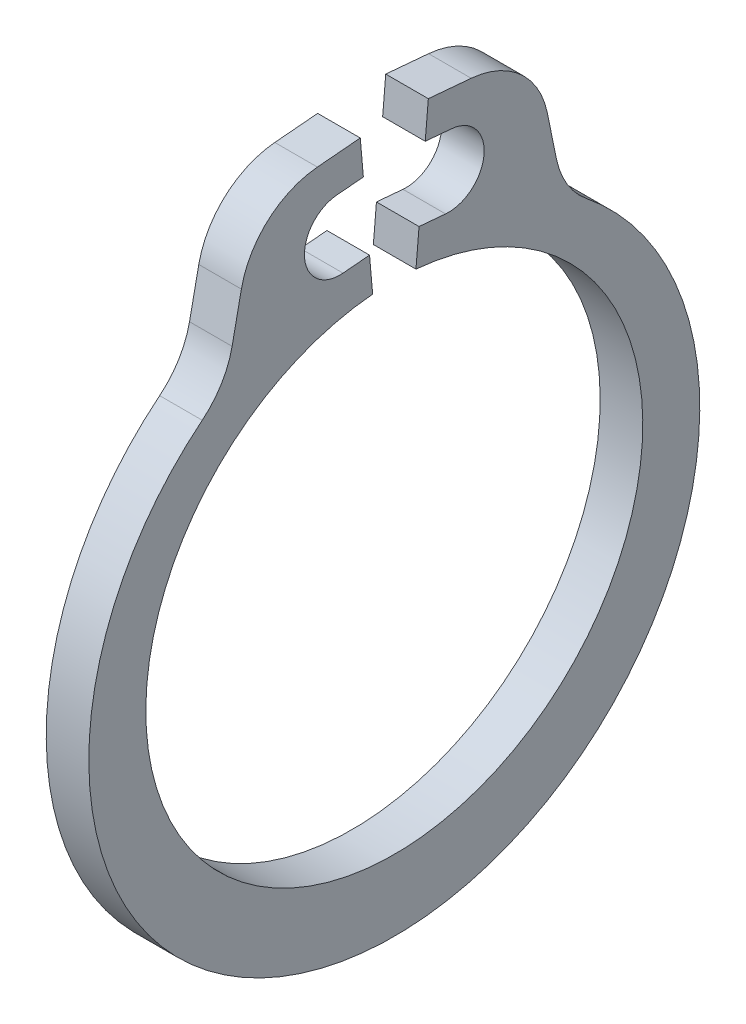
ISO-10303-21;
HEADER;
FILE_DESCRIPTION(('STEP AP214'),'2;1');
FILE_NAME('part.step','',(''),(''),'','','');
FILE_SCHEMA(('AUTOMOTIVE_DESIGN { 1 0 10303 214 1 1 1 1 }'));
ENDSEC;
DATA;
#1=APPLICATION_CONTEXT('core data for automotive mechanical design processes');
#2=APPLICATION_PROTOCOL_DEFINITION('international standard','automotive_design',2000,#1);
#3=PRODUCT_CONTEXT('',#1,'mechanical');
#4=PRODUCT('Part','Part','',(#3));
#5=PRODUCT_RELATED_PRODUCT_CATEGORY('part','',(#4));
#6=PRODUCT_DEFINITION_FORMATION('','',#4);
#7=PRODUCT_DEFINITION_CONTEXT('part definition',#1,'design');
#8=PRODUCT_DEFINITION('design','',#6,#7);
#9=PRODUCT_DEFINITION_SHAPE('','',#8);
#10=(LENGTH_UNIT() NAMED_UNIT(*) SI_UNIT(.MILLI.,.METRE.));
#11=(NAMED_UNIT(*) PLANE_ANGLE_UNIT() SI_UNIT($,.RADIAN.));
#12=(NAMED_UNIT(*) SI_UNIT($,.STERADIAN.) SOLID_ANGLE_UNIT());
#13=UNCERTAINTY_MEASURE_WITH_UNIT(LENGTH_MEASURE(1.E-05),#10,'distance_accuracy_value','');
#14=(GEOMETRIC_REPRESENTATION_CONTEXT(3) GLOBAL_UNCERTAINTY_ASSIGNED_CONTEXT((#13)) GLOBAL_UNIT_ASSIGNED_CONTEXT((#10,
#11,#12)) REPRESENTATION_CONTEXT('',''));
#15=CARTESIAN_POINT('',(0.,0.,0.));
#16=DIRECTION('',(0.,0.,1.));
#17=DIRECTION('',(1.,0.,0.));
#18=AXIS2_PLACEMENT_3D('',#15,#16,#17);
#19=CARTESIAN_POINT('',(0.1905,0.,0.));
#20=DIRECTION('',(-1.,0.,0.));
#21=DIRECTION('',(0.,0.,1.));
#22=AXIS2_PLACEMENT_3D('',#19,#20,#21);
#23=CYLINDRICAL_SURFACE('',#22,2.2225);
#24=CARTESIAN_POINT('',(-0.1905,0.,0.));
#25=DIRECTION('',(-1.,0.,0.));
#26=DIRECTION('',(0.,0.,-1.));
#27=AXIS2_PLACEMENT_3D('',#24,#25,#26);
#28=CIRCLE('',#27,2.2225);
#29=CARTESIAN_POINT('',(-0.1905,2.2140427165089,-0.193703638256671));
#30=VERTEX_POINT('',#29);
#31=CARTESIAN_POINT('',(-0.1905,2.2140427165089,0.193703638256671));
#32=VERTEX_POINT('',#31);
#33=EDGE_CURVE('E195',#30,#32,#28,.T.);
#34=ORIENTED_EDGE('',*,*,#33,.T.);
#35=DIRECTION('',(-1.,0.,0.));
#36=VECTOR('',#35,1.);
#37=CARTESIAN_POINT('',(0.1905,2.2140427165089,0.193703638256671));
#38=LINE('',#37,#36);
#39=CARTESIAN_POINT('',(0.1905,2.2140427165089,0.193703638256671));
#40=VERTEX_POINT('',#39);
#41=EDGE_CURVE('E177',#40,#32,#38,.T.);
#42=ORIENTED_EDGE('',*,*,#41,.F.);
#43=CARTESIAN_POINT('',(0.1905,0.,0.));
#44=DIRECTION('',(-1.,0.,0.));
#45=DIRECTION('',(0.,0.,-1.));
#46=AXIS2_PLACEMENT_3D('',#43,#44,#45);
#47=CIRCLE('',#46,2.2225);
#48=CARTESIAN_POINT('',(0.1905,2.2140427165089,-0.193703638256671));
#49=VERTEX_POINT('',#48);
#50=EDGE_CURVE('E183',#49,#40,#47,.T.);
#51=ORIENTED_EDGE('',*,*,#50,.F.);
#52=DIRECTION('',(-1.,0.,0.));
#53=VECTOR('',#52,1.);
#54=CARTESIAN_POINT('',(0.1905,2.2140427165089,-0.193703638256671));
#55=LINE('',#54,#53);
#56=EDGE_CURVE('E273',#49,#30,#55,.T.);
#57=ORIENTED_EDGE('',*,*,#56,.T.);
#58=EDGE_LOOP('',(#34,#42,#51,#57));
#59=FACE_BOUND('',#58,.T.);
#60=ADVANCED_FACE('F34',(#59),#23,.F.);
#61=CARTESIAN_POINT('',(0.1905,2.53033453315303,0.221375586579052));
#62=DIRECTION('',(0.,-0.0871557427476582,0.996194698091745));
#63=DIRECTION('',(0.,-0.996194698091746,-0.0871557427476583));
#64=AXIS2_PLACEMENT_3D('',#61,#62,#63);
#65=PLANE('',#64);
#66=DIRECTION('',(0.,0.996194698091746,0.0871557427476583));
#67=VECTOR('',#66,1.);
#68=CARTESIAN_POINT('',(-0.1905,2.53033453315303,0.221375586579052));
#69=LINE('',#68,#67);
#70=CARTESIAN_POINT('',(-0.1905,2.53033453315303,0.221375586579052));
#71=VERTEX_POINT('',#70);
#72=EDGE_CURVE('E275',#32,#71,#69,.T.);
#73=ORIENTED_EDGE('',*,*,#72,.T.);
#74=DIRECTION('',(-1.,0.,0.));
#75=VECTOR('',#74,1.);
#76=CARTESIAN_POINT('',(0.1905,2.53033453315303,0.221375586579052));
#77=LINE('',#76,#75);
#78=CARTESIAN_POINT('',(0.1905,2.53033453315303,0.221375586579052));
#79=VERTEX_POINT('',#78);
#80=EDGE_CURVE('E180',#79,#71,#77,.T.);
#81=ORIENTED_EDGE('',*,*,#80,.F.);
#82=DIRECTION('',(0.,0.996194698091746,0.0871557427476583));
#83=VECTOR('',#82,1.);
#84=CARTESIAN_POINT('',(0.1905,2.53033453315303,0.221375586579052));
#85=LINE('',#84,#83);
#86=EDGE_CURVE('E173',#40,#79,#85,.T.);
#87=ORIENTED_EDGE('',*,*,#86,.F.);
#88=ORIENTED_EDGE('',*,*,#41,.T.);
#89=EDGE_LOOP('',(#73,#81,#87,#88));
#90=FACE_BOUND('',#89,.T.);
#91=ADVANCED_FACE('F175',(#90),#65,.F.);
#92=CARTESIAN_POINT('',(0.1905,2.53033453315303,0.221375586579052));
#93=DIRECTION('',(0.,-0.996194698091745,-0.0871557427476591));
#94=DIRECTION('',(0.,0.0871557427476591,-0.996194698091746));
#95=AXIS2_PLACEMENT_3D('',#92,#93,#94);
#96=PLANE('',#95);
#97=DIRECTION('',(0.,-0.0871557427476591,0.996194698091745));
#98=VECTOR('',#97,1.);
#99=CARTESIAN_POINT('',(-0.1905,2.53033453315303,0.221375586579052));
#100=LINE('',#99,#98);
#101=CARTESIAN_POINT('',(-0.1905,2.50958057191125,0.458594449062149));
#102=VERTEX_POINT('',#101);
#103=EDGE_CURVE('E277',#71,#102,#100,.T.);
#104=ORIENTED_EDGE('',*,*,#103,.T.);
#105=DIRECTION('',(-1.,0.,0.));
#106=VECTOR('',#105,1.);
#107=CARTESIAN_POINT('',(0.1905,2.50958057191125,0.458594449062149));
#108=LINE('',#107,#106);
#109=CARTESIAN_POINT('',(0.1905,2.50958057191125,0.458594449062149));
#110=VERTEX_POINT('',#109);
#111=EDGE_CURVE('E200',#110,#102,#108,.T.);
#112=ORIENTED_EDGE('',*,*,#111,.F.);
#113=DIRECTION('',(0.,-0.0871557427476591,0.996194698091745));
#114=VECTOR('',#113,1.);
#115=CARTESIAN_POINT('',(0.1905,2.53033453315303,0.221375586579052));
#116=LINE('',#115,#114);
#117=EDGE_CURVE('E182',#79,#110,#116,.T.);
#118=ORIENTED_EDGE('',*,*,#117,.F.);
#119=ORIENTED_EDGE('',*,*,#80,.T.);
#120=EDGE_LOOP('',(#104,#112,#118,#119));
#121=FACE_BOUND('',#120,.T.);
#122=ADVANCED_FACE('F379',(#121),#96,.F.);
#123=CARTESIAN_POINT('',(0.1905,2.82587238855538,0.486266397384531));
#124=DIRECTION('',(-1.,0.,0.));
#125=DIRECTION('',(0.,0.,1.));
#126=AXIS2_PLACEMENT_3D('',#123,#124,#125);
#127=CYLINDRICAL_SURFACE('',#126,0.3175);
#128=CARTESIAN_POINT('',(-0.1905,2.82587238855538,0.486266397384531));
#129=DIRECTION('',(-1.,0.,0.));
#130=DIRECTION('',(0.,0.,1.));
#131=AXIS2_PLACEMENT_3D('',#128,#129,#130);
#132=CIRCLE('',#131,0.3175);
#133=CARTESIAN_POINT('',(-0.1905,3.14216420519951,0.513938345706912));
#134=VERTEX_POINT('',#133);
#135=EDGE_CURVE('E279',#102,#134,#132,.T.);
#136=ORIENTED_EDGE('',*,*,#135,.T.);
#137=DIRECTION('',(-1.,0.,0.));
#138=VECTOR('',#137,1.);
#139=CARTESIAN_POINT('',(0.1905,3.14216420519951,0.513938345706912));
#140=LINE('',#139,#138);
#141=CARTESIAN_POINT('',(0.1905,3.14216420519951,0.513938345706912));
#142=VERTEX_POINT('',#141);
#143=EDGE_CURVE('E323',#142,#134,#140,.T.);
#144=ORIENTED_EDGE('',*,*,#143,.F.);
#145=CARTESIAN_POINT('',(0.1905,2.82587238855538,0.486266397384531));
#146=DIRECTION('',(-1.,0.,0.));
#147=DIRECTION('',(0.,0.,1.));
#148=AXIS2_PLACEMENT_3D('',#145,#146,#147);
#149=CIRCLE('',#148,0.3175);
#150=EDGE_CURVE('E332',#110,#142,#149,.T.);
#151=ORIENTED_EDGE('',*,*,#150,.F.);
#152=ORIENTED_EDGE('',*,*,#111,.T.);
#153=EDGE_LOOP('',(#136,#144,#151,#152));
#154=FACE_BOUND('',#153,.T.);
#155=ADVANCED_FACE('F330',(#154),#127,.F.);
#156=CARTESIAN_POINT('',(0.1905,3.16291816644129,0.276719483223815));
#157=DIRECTION('',(0.,0.996194698091746,0.0871557427476555));
#158=DIRECTION('',(0.,-0.0871557427476555,0.996194698091746));
#159=AXIS2_PLACEMENT_3D('',#156,#157,#158);
#160=PLANE('',#159);
#161=DIRECTION('',(0.,0.0871557427476555,-0.996194698091746));
#162=VECTOR('',#161,1.);
#163=CARTESIAN_POINT('',(-0.1905,3.16291816644129,0.276719483223815));
#164=LINE('',#163,#162);
#165=CARTESIAN_POINT('',(-0.1905,3.16291816644129,0.276719483223815));
#166=VERTEX_POINT('',#165);
#167=EDGE_CURVE('E281',#134,#166,#164,.T.);
#168=ORIENTED_EDGE('',*,*,#167,.T.);
#169=DIRECTION('',(-1.,0.,0.));
#170=VECTOR('',#169,1.);
#171=CARTESIAN_POINT('',(0.1905,3.16291816644129,0.276719483223815));
#172=LINE('',#171,#170);
#173=CARTESIAN_POINT('',(0.1905,3.16291816644129,0.276719483223815));
#174=VERTEX_POINT('',#173);
#175=EDGE_CURVE('E320',#174,#166,#172,.T.);
#176=ORIENTED_EDGE('',*,*,#175,.F.);
#177=DIRECTION('',(0.,0.0871557427476555,-0.996194698091746));
#178=VECTOR('',#177,1.);
#179=CARTESIAN_POINT('',(0.1905,3.16291816644129,0.276719483223815));
#180=LINE('',#179,#178);
#181=EDGE_CURVE('E348',#142,#174,#180,.T.);
#182=ORIENTED_EDGE('',*,*,#181,.F.);
#183=ORIENTED_EDGE('',*,*,#143,.T.);
#184=EDGE_LOOP('',(#168,#176,#182,#183));
#185=FACE_BOUND('',#184,.T.);
#186=ADVANCED_FACE('F340',(#185),#160,.F.);
#187=CARTESIAN_POINT('',(0.1905,3.16291816644129,0.276719483223815));
#188=DIRECTION('',(0.,-0.0871557427476582,0.996194698091745));
#189=DIRECTION('',(0.,-0.996194698091746,-0.0871557427476583));
#190=AXIS2_PLACEMENT_3D('',#187,#188,#189);
#191=PLANE('',#190);
#192=DIRECTION('',(0.,0.996194698091746,0.0871557427476583));
#193=VECTOR('',#192,1.);
#194=CARTESIAN_POINT('',(-0.1905,3.16291816644129,0.276719483223815));
#195=LINE('',#194,#193);
#196=CARTESIAN_POINT('',(-0.1905,3.47920998308542,0.304391431546197));
#197=VERTEX_POINT('',#196);
#198=EDGE_CURVE('E283',#166,#197,#195,.T.);
#199=ORIENTED_EDGE('',*,*,#198,.T.);
#200=DIRECTION('',(-1.,0.,0.));
#201=VECTOR('',#200,1.);
#202=CARTESIAN_POINT('',(0.1905,3.47920998308542,0.304391431546197));
#203=LINE('',#202,#201);
#204=CARTESIAN_POINT('',(0.1905,3.47920998308542,0.304391431546197));
#205=VERTEX_POINT('',#204);
#206=EDGE_CURVE('E317',#205,#197,#203,.T.);
#207=ORIENTED_EDGE('',*,*,#206,.F.);
#208=DIRECTION('',(0.,0.996194698091746,0.0871557427476583));
#209=VECTOR('',#208,1.);
#210=CARTESIAN_POINT('',(0.1905,3.16291816644129,0.276719483223815));
#211=LINE('',#210,#209);
#212=EDGE_CURVE('E346',#174,#205,#211,.T.);
#213=ORIENTED_EDGE('',*,*,#212,.F.);
#214=ORIENTED_EDGE('',*,*,#175,.T.);
#215=EDGE_LOOP('',(#199,#207,#213,#214));
#216=FACE_BOUND('',#215,.T.);
#217=ADVANCED_FACE('F344',(#216),#191,.F.);
#218=CARTESIAN_POINT('',(0.1905,3.47920998308542,0.304391431546197));
#219=DIRECTION('',(0.,-0.996194698091745,-0.0871557427476583));
#220=DIRECTION('',(0.,0.0871557427476583,-0.996194698091746));
#221=AXIS2_PLACEMENT_3D('',#218,#219,#220);
#222=PLANE('',#221);
#223=DIRECTION('',(0.,-0.0871557427476583,0.996194698091746));
#224=VECTOR('',#223,1.);
#225=CARTESIAN_POINT('',(-0.1905,3.47920998308542,0.304391431546197));
#226=LINE('',#225,#224);
#227=CARTESIAN_POINT('',(-0.1905,3.44565988424809,0.687870816019726));
#228=VERTEX_POINT('',#227);
#229=EDGE_CURVE('E285',#197,#228,#226,.T.);
#230=ORIENTED_EDGE('',*,*,#229,.T.);
#231=DIRECTION('',(-1.,0.,0.));
#232=VECTOR('',#231,1.);
#233=CARTESIAN_POINT('',(0.1905,3.44565988424809,0.687870816019726));
#234=LINE('',#233,#232);
#235=CARTESIAN_POINT('',(0.1905,3.44565988424809,0.687870816019726));
#236=VERTEX_POINT('',#235);
#237=EDGE_CURVE('E57',#228,#236,#234,.F.);
#238=ORIENTED_EDGE('',*,*,#237,.T.);
#239=DIRECTION('',(0.,-0.0871557427476583,0.996194698091746));
#240=VECTOR('',#239,1.);
#241=CARTESIAN_POINT('',(0.1905,3.47920998308542,0.304391431546197));
#242=LINE('',#241,#240);
#243=EDGE_CURVE('E347',#205,#236,#242,.T.);
#244=ORIENTED_EDGE('',*,*,#243,.F.);
#245=ORIENTED_EDGE('',*,*,#206,.T.);
#246=EDGE_LOOP('',(#230,#238,#244,#245));
#247=FACE_BOUND('',#246,.T.);
#248=ADVANCED_FACE('F365',(#247),#222,.F.);
#249=CARTESIAN_POINT('',(0.1905,3.39619413811828,1.25326688147858));
#250=DIRECTION('',(0.,-0.201774721969888,-0.979431958623964));
#251=DIRECTION('',(0.,0.979431958623964,-0.201774721969888));
#252=AXIS2_PLACEMENT_3D('',#249,#250,#251);
#253=PLANE('',#252);
#254=DIRECTION('',(0.,-0.979431958623964,0.201774721969888));
#255=VECTOR('',#254,1.);
#256=CARTESIAN_POINT('',(-0.1905,3.39619413811828,1.25326688147858));
#257=LINE('',#256,#255);
#258=CARTESIAN_POINT('',(-0.1905,2.84031186244323,1.36778529251747));
#259=VERTEX_POINT('',#258);
#260=CARTESIAN_POINT('',(-0.1905,2.43840907976544,1.45058208255449));
#261=VERTEX_POINT('',#260);
#262=EDGE_CURVE('E247',#259,#261,#257,.T.);
#263=ORIENTED_EDGE('',*,*,#262,.T.);
#264=DIRECTION('',(1.,0.,0.));
#265=VECTOR('',#264,1.);
#266=CARTESIAN_POINT('',(0.1905,2.43840907976544,1.45058208255449));
#267=LINE('',#266,#265);
#268=CARTESIAN_POINT('',(0.1905,2.43840907976544,1.45058208255449));
#269=VERTEX_POINT('',#268);
#270=EDGE_CURVE('E209',#261,#269,#267,.T.);
#271=ORIENTED_EDGE('',*,*,#270,.T.);
#272=DIRECTION('',(0.,-0.979431958623964,0.201774721969888));
#273=VECTOR('',#272,1.);
#274=CARTESIAN_POINT('',(0.1905,3.39619413811828,1.25326688147858));
#275=LINE('',#274,#273);
#276=CARTESIAN_POINT('',(0.1905,2.84031186244323,1.36778529251747));
#277=VERTEX_POINT('',#276);
#278=EDGE_CURVE('E261',#277,#269,#275,.T.);
#279=ORIENTED_EDGE('',*,*,#278,.F.);
#280=DIRECTION('',(-1.,0.,0.));
#281=VECTOR('',#280,1.);
#282=CARTESIAN_POINT('',(0.1905,2.84031186244323,1.36778529251747));
#283=LINE('',#282,#281);
#284=EDGE_CURVE('E206',#277,#259,#283,.T.);
#285=ORIENTED_EDGE('',*,*,#284,.T.);
#286=EDGE_LOOP('',(#263,#271,#279,#285));
#287=FACE_BOUND('',#286,.T.);
#288=ADVANCED_FACE('F362',(#287),#253,.F.);
#289=CARTESIAN_POINT('',(0.1905,-0.125173374879372,0.));
#290=DIRECTION('',(-1.,0.,0.));
#291=DIRECTION('',(0.,0.,1.));
#292=AXIS2_PLACEMENT_3D('',#289,#290,#291);
#293=CYLINDRICAL_SURFACE('',#292,2.73232662512063);
#294=CARTESIAN_POINT('',(0.1905,-0.125173374879372,0.));
#295=DIRECTION('',(1.,0.,0.));
#296=DIRECTION('',(0.,0.,-1.));
#297=AXIS2_PLACEMENT_3D('',#294,#295,#296);
#298=CIRCLE('',#297,2.73232662512063);
#299=CARTESIAN_POINT('',(0.1905,1.9995982908029,1.71783414655108));
#300=VERTEX_POINT('',#299);
#301=CARTESIAN_POINT('',(0.1905,1.9995982908029,-1.71783414655108));
#302=VERTEX_POINT('',#301);
#303=EDGE_CURVE('E253',#300,#302,#298,.T.);
#304=ORIENTED_EDGE('',*,*,#303,.F.);
#305=DIRECTION('',(-1.,0.,0.));
#306=VECTOR('',#305,1.);
#307=CARTESIAN_POINT('',(0.1905,1.9995982908029,1.71783414655108));
#308=LINE('',#307,#306);
#309=CARTESIAN_POINT('',(-0.1905,1.9995982908029,1.71783414655108));
#310=VERTEX_POINT('',#309);
#311=EDGE_CURVE('E198',#300,#310,#308,.T.);
#312=ORIENTED_EDGE('',*,*,#311,.T.);
#313=CARTESIAN_POINT('',(-0.1905,-0.125173374879372,0.));
#314=DIRECTION('',(1.,0.,0.));
#315=DIRECTION('',(0.,0.,-1.));
#316=AXIS2_PLACEMENT_3D('',#313,#314,#315);
#317=CIRCLE('',#316,2.73232662512063);
#318=CARTESIAN_POINT('',(-0.1905,1.9995982908029,-1.71783414655108));
#319=VERTEX_POINT('',#318);
#320=EDGE_CURVE('E236',#310,#319,#317,.T.);
#321=ORIENTED_EDGE('',*,*,#320,.T.);
#322=DIRECTION('',(-1.,0.,0.));
#323=VECTOR('',#322,1.);
#324=CARTESIAN_POINT('',(0.1905,1.9995982908029,-1.71783414655108));
#325=LINE('',#324,#323);
#326=EDGE_CURVE('E196',#319,#302,#325,.F.);
#327=ORIENTED_EDGE('',*,*,#326,.T.);
#328=EDGE_LOOP('',(#304,#312,#321,#327));
#329=FACE_BOUND('',#328,.T.);
#330=ADVANCED_FACE('F244',(#329),#293,.T.);
#331=CARTESIAN_POINT('',(0.1905,3.39619413811828,-1.25326688147858));
#332=DIRECTION('',(0.,-0.201774721969888,0.979431958623964));
#333=DIRECTION('',(0.,-0.979431958623964,-0.201774721969888));
#334=AXIS2_PLACEMENT_3D('',#331,#332,#333);
#335=PLANE('',#334);
#336=DIRECTION('',(0.,0.979431958623964,0.201774721969888));
#337=VECTOR('',#336,1.);
#338=CARTESIAN_POINT('',(0.1905,3.39619413811828,-1.25326688147858));
#339=LINE('',#338,#337);
#340=CARTESIAN_POINT('',(0.1905,2.43840907976544,-1.45058208255449));
#341=VERTEX_POINT('',#340);
#342=CARTESIAN_POINT('',(0.1905,2.84031186244323,-1.36778529251747));
#343=VERTEX_POINT('',#342);
#344=EDGE_CURVE('E252',#341,#343,#339,.T.);
#345=ORIENTED_EDGE('',*,*,#344,.F.);
#346=DIRECTION('',(1.,0.,0.));
#347=VECTOR('',#346,1.);
#348=CARTESIAN_POINT('',(-0.1905,2.43840907976544,-1.45058208255449));
#349=LINE('',#348,#347);
#350=CARTESIAN_POINT('',(-0.1905,2.43840907976544,-1.45058208255449));
#351=VERTEX_POINT('',#350);
#352=EDGE_CURVE('E213',#341,#351,#349,.F.);
#353=ORIENTED_EDGE('',*,*,#352,.T.);
#354=DIRECTION('',(0.,0.979431958623964,0.201774721969888));
#355=VECTOR('',#354,1.);
#356=CARTESIAN_POINT('',(-0.1905,3.39619413811828,-1.25326688147858));
#357=LINE('',#356,#355);
#358=CARTESIAN_POINT('',(-0.1905,2.84031186244323,-1.36778529251747));
#359=VERTEX_POINT('',#358);
#360=EDGE_CURVE('E238',#351,#359,#357,.T.);
#361=ORIENTED_EDGE('',*,*,#360,.T.);
#362=DIRECTION('',(-1.,0.,0.));
#363=VECTOR('',#362,1.);
#364=CARTESIAN_POINT('',(0.1905,2.84031186244323,-1.36778529251747));
#365=LINE('',#364,#363);
#366=EDGE_CURVE('E211',#359,#343,#365,.F.);
#367=ORIENTED_EDGE('',*,*,#366,.T.);
#368=EDGE_LOOP('',(#345,#353,#361,#367));
#369=FACE_BOUND('',#368,.T.);
#370=ADVANCED_FACE('F255',(#369),#335,.F.);
#371=CARTESIAN_POINT('',(0.1905,3.47920998308542,-0.304391431546197));
#372=DIRECTION('',(0.,-0.996194698091745,0.0871557427476583));
#373=DIRECTION('',(0.,-0.0871557427476583,-0.996194698091746));
#374=AXIS2_PLACEMENT_3D('',#371,#372,#373);
#375=PLANE('',#374);
#376=DIRECTION('',(0.,0.0871557427476583,0.996194698091746));
#377=VECTOR('',#376,1.);
#378=CARTESIAN_POINT('',(0.1905,3.47920998308542,-0.304391431546197));
#379=LINE('',#378,#377);
#380=CARTESIAN_POINT('',(0.1905,3.44565988424809,-0.687870816019726));
#381=VERTEX_POINT('',#380);
#382=CARTESIAN_POINT('',(0.1905,3.47920998308542,-0.304391431546197));
#383=VERTEX_POINT('',#382);
#384=EDGE_CURVE('E257',#381,#383,#379,.T.);
#385=ORIENTED_EDGE('',*,*,#384,.F.);
#386=DIRECTION('',(-1.,0.,0.));
#387=VECTOR('',#386,1.);
#388=CARTESIAN_POINT('',(0.1905,3.44565988424809,-0.687870816019726));
#389=LINE('',#388,#387);
#390=CARTESIAN_POINT('',(-0.1905,3.44565988424809,-0.687870816019726));
#391=VERTEX_POINT('',#390);
#392=EDGE_CURVE('E224',#381,#391,#389,.T.);
#393=ORIENTED_EDGE('',*,*,#392,.T.);
#394=DIRECTION('',(0.,0.0871557427476583,0.996194698091746));
#395=VECTOR('',#394,1.);
#396=CARTESIAN_POINT('',(-0.1905,3.47920998308542,-0.304391431546197));
#397=LINE('',#396,#395);
#398=CARTESIAN_POINT('',(-0.1905,3.47920998308542,-0.304391431546197));
#399=VERTEX_POINT('',#398);
#400=EDGE_CURVE('E290',#391,#399,#397,.T.);
#401=ORIENTED_EDGE('',*,*,#400,.T.);
#402=DIRECTION('',(-1.,0.,0.));
#403=VECTOR('',#402,1.);
#404=CARTESIAN_POINT('',(0.1905,3.47920998308542,-0.304391431546197));
#405=LINE('',#404,#403);
#406=EDGE_CURVE('E314',#383,#399,#405,.T.);
#407=ORIENTED_EDGE('',*,*,#406,.F.);
#408=EDGE_LOOP('',(#385,#393,#401,#407));
#409=FACE_BOUND('',#408,.T.);
#410=ADVANCED_FACE('F396',(#409),#375,.F.);
#411=CARTESIAN_POINT('',(0.1905,3.16291816644129,-0.276719483223815));
#412=DIRECTION('',(0.,-0.0871557427476582,-0.996194698091745));
#413=DIRECTION('',(0.,0.996194698091746,-0.0871557427476583));
#414=AXIS2_PLACEMENT_3D('',#411,#412,#413);
#415=PLANE('',#414);
#416=DIRECTION('',(0.,-0.996194698091746,0.0871557427476583));
#417=VECTOR('',#416,1.);
#418=CARTESIAN_POINT('',(-0.1905,3.16291816644129,-0.276719483223815));
#419=LINE('',#418,#417);
#420=CARTESIAN_POINT('',(-0.1905,3.16291816644129,-0.276719483223815));
#421=VERTEX_POINT('',#420);
#422=EDGE_CURVE('E292',#399,#421,#419,.T.);
#423=ORIENTED_EDGE('',*,*,#422,.T.);
#424=DIRECTION('',(-1.,0.,0.));
#425=VECTOR('',#424,1.);
#426=CARTESIAN_POINT('',(0.1905,3.16291816644129,-0.276719483223815));
#427=LINE('',#426,#425);
#428=CARTESIAN_POINT('',(0.1905,3.16291816644129,-0.276719483223815));
#429=VERTEX_POINT('',#428);
#430=EDGE_CURVE('E311',#429,#421,#427,.T.);
#431=ORIENTED_EDGE('',*,*,#430,.F.);
#432=DIRECTION('',(0.,-0.996194698091746,0.0871557427476583));
#433=VECTOR('',#432,1.);
#434=CARTESIAN_POINT('',(0.1905,3.16291816644129,-0.276719483223815));
#435=LINE('',#434,#433);
#436=EDGE_CURVE('E259',#383,#429,#435,.T.);
#437=ORIENTED_EDGE('',*,*,#436,.F.);
#438=ORIENTED_EDGE('',*,*,#406,.T.);
#439=EDGE_LOOP('',(#423,#431,#437,#438));
#440=FACE_BOUND('',#439,.T.);
#441=ADVANCED_FACE('F403',(#440),#415,.F.);
#442=CARTESIAN_POINT('',(0.1905,3.16291816644129,-0.276719483223815));
#443=DIRECTION('',(0.,0.996194698091745,-0.087155742747661));
#444=DIRECTION('',(0.,0.087155742747661,0.996194698091745));
#445=AXIS2_PLACEMENT_3D('',#442,#443,#444);
#446=PLANE('',#445);
#447=DIRECTION('',(0.,-0.087155742747661,-0.996194698091745));
#448=VECTOR('',#447,1.);
#449=CARTESIAN_POINT('',(-0.1905,3.16291816644129,-0.276719483223815));
#450=LINE('',#449,#448);
#451=CARTESIAN_POINT('',(-0.1905,3.1421642051995,-0.513938345706912));
#452=VERTEX_POINT('',#451);
#453=EDGE_CURVE('E294',#421,#452,#450,.T.);
#454=ORIENTED_EDGE('',*,*,#453,.T.);
#455=DIRECTION('',(-1.,0.,0.));
#456=VECTOR('',#455,1.);
#457=CARTESIAN_POINT('',(0.1905,3.1421642051995,-0.513938345706912));
#458=LINE('',#457,#456);
#459=CARTESIAN_POINT('',(0.1905,3.1421642051995,-0.513938345706912));
#460=VERTEX_POINT('',#459);
#461=EDGE_CURVE('E308',#460,#452,#458,.T.);
#462=ORIENTED_EDGE('',*,*,#461,.F.);
#463=DIRECTION('',(0.,-0.087155742747661,-0.996194698091745));
#464=VECTOR('',#463,1.);
#465=CARTESIAN_POINT('',(0.1905,3.16291816644129,-0.276719483223815));
#466=LINE('',#465,#464);
#467=EDGE_CURVE('E266',#429,#460,#466,.T.);
#468=ORIENTED_EDGE('',*,*,#467,.F.);
#469=ORIENTED_EDGE('',*,*,#430,.T.);
#470=EDGE_LOOP('',(#454,#462,#468,#469));
#471=FACE_BOUND('',#470,.T.);
#472=ADVANCED_FACE('F407',(#471),#446,.F.);
#473=CARTESIAN_POINT('',(0.1905,2.82587238855538,-0.486266397384531));
#474=DIRECTION('',(-1.,0.,0.));
#475=DIRECTION('',(0.,0.,1.));
#476=AXIS2_PLACEMENT_3D('',#473,#474,#475);
#477=CYLINDRICAL_SURFACE('',#476,0.3175);
#478=CARTESIAN_POINT('',(-0.1905,2.82587238855538,-0.486266397384531));
#479=DIRECTION('',(-1.,0.,0.));
#480=DIRECTION('',(0.,0.,-1.));
#481=AXIS2_PLACEMENT_3D('',#478,#479,#480);
#482=CIRCLE('',#481,0.3175);
#483=CARTESIAN_POINT('',(-0.1905,2.50958057191125,-0.458594449062149));
#484=VERTEX_POINT('',#483);
#485=EDGE_CURVE('E296',#452,#484,#482,.T.);
#486=ORIENTED_EDGE('',*,*,#485,.T.);
#487=DIRECTION('',(-1.,0.,0.));
#488=VECTOR('',#487,1.);
#489=CARTESIAN_POINT('',(0.1905,2.50958057191125,-0.458594449062149));
#490=LINE('',#489,#488);
#491=CARTESIAN_POINT('',(0.1905,2.50958057191125,-0.458594449062149));
#492=VERTEX_POINT('',#491);
#493=EDGE_CURVE('E305',#492,#484,#490,.T.);
#494=ORIENTED_EDGE('',*,*,#493,.F.);
#495=CARTESIAN_POINT('',(0.1905,2.82587238855538,-0.486266397384531));
#496=DIRECTION('',(-1.,0.,0.));
#497=DIRECTION('',(0.,0.,-1.));
#498=AXIS2_PLACEMENT_3D('',#495,#496,#497);
#499=CIRCLE('',#498,0.3175);
#500=EDGE_CURVE('E268',#460,#492,#499,.T.);
#501=ORIENTED_EDGE('',*,*,#500,.F.);
#502=ORIENTED_EDGE('',*,*,#461,.T.);
#503=EDGE_LOOP('',(#486,#494,#501,#502));
#504=FACE_BOUND('',#503,.T.);
#505=ADVANCED_FACE('F414',(#504),#477,.F.);
#506=CARTESIAN_POINT('',(0.1905,2.53033453315303,-0.221375586579052));
#507=DIRECTION('',(0.,-0.996194698091745,0.0871557427476591));
#508=DIRECTION('',(0.,-0.0871557427476591,-0.996194698091746));
#509=AXIS2_PLACEMENT_3D('',#506,#507,#508);
#510=PLANE('',#509);
#511=DIRECTION('',(0.,0.0871557427476591,0.996194698091745));
#512=VECTOR('',#511,1.);
#513=CARTESIAN_POINT('',(-0.1905,2.53033453315303,-0.221375586579052));
#514=LINE('',#513,#512);
#515=CARTESIAN_POINT('',(-0.1905,2.53033453315303,-0.221375586579052));
#516=VERTEX_POINT('',#515);
#517=EDGE_CURVE('E298',#484,#516,#514,.T.);
#518=ORIENTED_EDGE('',*,*,#517,.T.);
#519=DIRECTION('',(-1.,0.,0.));
#520=VECTOR('',#519,1.);
#521=CARTESIAN_POINT('',(0.1905,2.53033453315303,-0.221375586579052));
#522=LINE('',#521,#520);
#523=CARTESIAN_POINT('',(0.1905,2.53033453315303,-0.221375586579052));
#524=VERTEX_POINT('',#523);
#525=EDGE_CURVE('E302',#524,#516,#522,.T.);
#526=ORIENTED_EDGE('',*,*,#525,.F.);
#527=DIRECTION('',(0.,0.0871557427476591,0.996194698091745));
#528=VECTOR('',#527,1.);
#529=CARTESIAN_POINT('',(0.1905,2.53033453315303,-0.221375586579052));
#530=LINE('',#529,#528);
#531=EDGE_CURVE('E270',#492,#524,#530,.T.);
#532=ORIENTED_EDGE('',*,*,#531,.F.);
#533=ORIENTED_EDGE('',*,*,#493,.T.);
#534=EDGE_LOOP('',(#518,#526,#532,#533));
#535=FACE_BOUND('',#534,.T.);
#536=ADVANCED_FACE('F417',(#535),#510,.F.);
#537=CARTESIAN_POINT('',(0.1905,2.53033453315303,-0.221375586579052));
#538=DIRECTION('',(0.,-0.0871557427476582,-0.996194698091745));
#539=DIRECTION('',(0.,0.996194698091746,-0.0871557427476583));
#540=AXIS2_PLACEMENT_3D('',#537,#538,#539);
#541=PLANE('',#540);
#542=DIRECTION('',(0.,-0.996194698091746,0.0871557427476583));
#543=VECTOR('',#542,1.);
#544=CARTESIAN_POINT('',(-0.1905,2.53033453315303,-0.221375586579052));
#545=LINE('',#544,#543);
#546=EDGE_CURVE('E192',#516,#30,#545,.T.);
#547=ORIENTED_EDGE('',*,*,#546,.T.);
#548=ORIENTED_EDGE('',*,*,#56,.F.);
#549=DIRECTION('',(0.,-0.996194698091746,0.0871557427476583));
#550=VECTOR('',#549,1.);
#551=CARTESIAN_POINT('',(0.1905,2.53033453315303,-0.221375586579052));
#552=LINE('',#551,#550);
#553=EDGE_CURVE('E188',#524,#49,#552,.T.);
#554=ORIENTED_EDGE('',*,*,#553,.F.);
#555=ORIENTED_EDGE('',*,*,#525,.T.);
#556=EDGE_LOOP('',(#547,#548,#554,#555));
#557=FACE_BOUND('',#556,.T.);
#558=ADVANCED_FACE('F420',(#557),#541,.F.);
#559=CARTESIAN_POINT('',(0.1905,0.,0.));
#560=DIRECTION('',(1.,0.,0.));
#561=DIRECTION('',(0.,0.,-1.));
#562=AXIS2_PLACEMENT_3D('',#559,#560,#561);
#563=PLANE('',#562);
#564=ORIENTED_EDGE('',*,*,#243,.T.);
#565=CARTESIAN_POINT('',(0.1905,2.68655952430218,0.62145814004601));
#566=DIRECTION('',(1.,0.,0.));
#567=DIRECTION('',(0.,0.,-1.));
#568=AXIS2_PLACEMENT_3D('',#565,#566,#567);
#569=CIRCLE('',#568,0.762);
#570=EDGE_CURVE('E222',#236,#277,#569,.T.);
#571=ORIENTED_EDGE('',*,*,#570,.T.);
#572=ORIENTED_EDGE('',*,*,#278,.T.);
#573=CARTESIAN_POINT('',(0.1905,2.5921614179065,2.19690923502595));
#574=DIRECTION('',(1.,0.,0.));
#575=DIRECTION('',(0.,0.,-1.));
#576=AXIS2_PLACEMENT_3D('',#573,#574,#575);
#577=CIRCLE('',#576,0.762);
#578=EDGE_CURVE('E229',#269,#300,#577,.F.);
#579=ORIENTED_EDGE('',*,*,#578,.T.);
#580=ORIENTED_EDGE('',*,*,#303,.T.);
#581=CARTESIAN_POINT('',(0.1905,2.5921614179065,-2.19690923502595));
#582=DIRECTION('',(1.,0.,0.));
#583=DIRECTION('',(0.,0.,-1.));
#584=AXIS2_PLACEMENT_3D('',#581,#582,#583);
#585=CIRCLE('',#584,0.762);
#586=EDGE_CURVE('E11',#302,#341,#585,.F.);
#587=ORIENTED_EDGE('',*,*,#586,.T.);
#588=ORIENTED_EDGE('',*,*,#344,.T.);
#589=CARTESIAN_POINT('',(0.1905,2.68655952430218,-0.62145814004601));
#590=DIRECTION('',(1.,0.,0.));
#591=DIRECTION('',(0.,0.,-1.));
#592=AXIS2_PLACEMENT_3D('',#589,#590,#591);
#593=CIRCLE('',#592,0.762);
#594=EDGE_CURVE('E49',#343,#381,#593,.T.);
#595=ORIENTED_EDGE('',*,*,#594,.T.);
#596=ORIENTED_EDGE('',*,*,#384,.T.);
#597=ORIENTED_EDGE('',*,*,#436,.T.);
#598=ORIENTED_EDGE('',*,*,#467,.T.);
#599=ORIENTED_EDGE('',*,*,#500,.T.);
#600=ORIENTED_EDGE('',*,*,#531,.T.);
#601=ORIENTED_EDGE('',*,*,#553,.T.);
#602=ORIENTED_EDGE('',*,*,#50,.T.);
#603=ORIENTED_EDGE('',*,*,#86,.T.);
#604=ORIENTED_EDGE('',*,*,#117,.T.);
#605=ORIENTED_EDGE('',*,*,#150,.T.);
#606=ORIENTED_EDGE('',*,*,#181,.T.);
#607=ORIENTED_EDGE('',*,*,#212,.T.);
#608=EDGE_LOOP('',(#564,#571,#572,#579,#580,#587,#588,#595,#596,#597,#598,#599,#600,#601,#602,
#603,#604,#605,#606,#607));
#609=FACE_BOUND('',#608,.T.);
#610=ADVANCED_FACE('F186',(#609),#563,.T.);
#611=CARTESIAN_POINT('',(-0.1905,0.,0.));
#612=DIRECTION('',(1.,0.,0.));
#613=DIRECTION('',(0.,0.,-1.));
#614=AXIS2_PLACEMENT_3D('',#611,#612,#613);
#615=PLANE('',#614);
#616=ORIENTED_EDGE('',*,*,#262,.F.);
#617=CARTESIAN_POINT('',(-0.1905,2.68655952430218,0.62145814004601));
#618=DIRECTION('',(1.,0.,0.));
#619=DIRECTION('',(0.,0.,-1.));
#620=AXIS2_PLACEMENT_3D('',#617,#618,#619);
#621=CIRCLE('',#620,0.762);
#622=EDGE_CURVE('E218',#259,#228,#621,.F.);
#623=ORIENTED_EDGE('',*,*,#622,.T.);
#624=ORIENTED_EDGE('',*,*,#229,.F.);
#625=ORIENTED_EDGE('',*,*,#198,.F.);
#626=ORIENTED_EDGE('',*,*,#167,.F.);
#627=ORIENTED_EDGE('',*,*,#135,.F.);
#628=ORIENTED_EDGE('',*,*,#103,.F.);
#629=ORIENTED_EDGE('',*,*,#72,.F.);
#630=ORIENTED_EDGE('',*,*,#33,.F.);
#631=ORIENTED_EDGE('',*,*,#546,.F.);
#632=ORIENTED_EDGE('',*,*,#517,.F.);
#633=ORIENTED_EDGE('',*,*,#485,.F.);
#634=ORIENTED_EDGE('',*,*,#453,.F.);
#635=ORIENTED_EDGE('',*,*,#422,.F.);
#636=ORIENTED_EDGE('',*,*,#400,.F.);
#637=CARTESIAN_POINT('',(-0.1905,2.68655952430218,-0.62145814004601));
#638=DIRECTION('',(1.,0.,0.));
#639=DIRECTION('',(0.,0.,-1.));
#640=AXIS2_PLACEMENT_3D('',#637,#638,#639);
#641=CIRCLE('',#640,0.762);
#642=EDGE_CURVE('E216',#391,#359,#641,.F.);
#643=ORIENTED_EDGE('',*,*,#642,.T.);
#644=ORIENTED_EDGE('',*,*,#360,.F.);
#645=CARTESIAN_POINT('',(-0.1905,2.5921614179065,-2.19690923502595));
#646=DIRECTION('',(1.,0.,0.));
#647=DIRECTION('',(0.,0.,-1.));
#648=AXIS2_PLACEMENT_3D('',#645,#646,#647);
#649=CIRCLE('',#648,0.762);
#650=EDGE_CURVE('E42',#351,#319,#649,.T.);
#651=ORIENTED_EDGE('',*,*,#650,.T.);
#652=ORIENTED_EDGE('',*,*,#320,.F.);
#653=CARTESIAN_POINT('',(-0.1905,2.5921614179065,2.19690923502595));
#654=DIRECTION('',(1.,0.,0.));
#655=DIRECTION('',(0.,0.,-1.));
#656=AXIS2_PLACEMENT_3D('',#653,#654,#655);
#657=CIRCLE('',#656,0.762);
#658=EDGE_CURVE('E227',#310,#261,#657,.T.);
#659=ORIENTED_EDGE('',*,*,#658,.T.);
#660=EDGE_LOOP('',(#616,#623,#624,#625,#626,#627,#628,#629,#630,#631,#632,#633,#634,#635,#636,
#643,#644,#651,#652,#659));
#661=FACE_BOUND('',#660,.T.);
#662=ADVANCED_FACE('F235',(#661),#615,.F.);
#663=CARTESIAN_POINT('',(0.1905,2.5921614179065,2.19690923502595));
#664=DIRECTION('',(-1.,0.,0.));
#665=DIRECTION('',(0.,0.,1.));
#666=AXIS2_PLACEMENT_3D('',#663,#664,#665);
#667=CYLINDRICAL_SURFACE('',#666,0.762);
#668=ORIENTED_EDGE('',*,*,#578,.F.);
#669=ORIENTED_EDGE('',*,*,#270,.F.);
#670=ORIENTED_EDGE('',*,*,#658,.F.);
#671=ORIENTED_EDGE('',*,*,#311,.F.);
#672=EDGE_LOOP('',(#668,#669,#670,#671));
#673=FACE_BOUND('',#672,.T.);
#674=ADVANCED_FACE('F361',(#673),#667,.F.);
#675=CARTESIAN_POINT('',(0.1905,2.5921614179065,-2.19690923502595));
#676=DIRECTION('',(-1.,0.,0.));
#677=DIRECTION('',(0.,0.,1.));
#678=AXIS2_PLACEMENT_3D('',#675,#676,#677);
#679=CYLINDRICAL_SURFACE('',#678,0.762);
#680=ORIENTED_EDGE('',*,*,#586,.F.);
#681=ORIENTED_EDGE('',*,*,#326,.F.);
#682=ORIENTED_EDGE('',*,*,#650,.F.);
#683=ORIENTED_EDGE('',*,*,#352,.F.);
#684=EDGE_LOOP('',(#680,#681,#682,#683));
#685=FACE_BOUND('',#684,.T.);
#686=ADVANCED_FACE('F250',(#685),#679,.F.);
#687=CARTESIAN_POINT('',(0.1905,2.68655952430218,0.62145814004601));
#688=DIRECTION('',(-1.,0.,0.));
#689=DIRECTION('',(0.,0.,1.));
#690=AXIS2_PLACEMENT_3D('',#687,#688,#689);
#691=CYLINDRICAL_SURFACE('',#690,0.762);
#692=ORIENTED_EDGE('',*,*,#570,.F.);
#693=ORIENTED_EDGE('',*,*,#237,.F.);
#694=ORIENTED_EDGE('',*,*,#622,.F.);
#695=ORIENTED_EDGE('',*,*,#284,.F.);
#696=EDGE_LOOP('',(#692,#693,#694,#695));
#697=FACE_BOUND('',#696,.T.);
#698=ADVANCED_FACE('F364',(#697),#691,.T.);
#699=CARTESIAN_POINT('',(0.1905,2.68655952430218,-0.62145814004601));
#700=DIRECTION('',(-1.,0.,0.));
#701=DIRECTION('',(0.,0.,1.));
#702=AXIS2_PLACEMENT_3D('',#699,#700,#701);
#703=CYLINDRICAL_SURFACE('',#702,0.762);
#704=ORIENTED_EDGE('',*,*,#594,.F.);
#705=ORIENTED_EDGE('',*,*,#366,.F.);
#706=ORIENTED_EDGE('',*,*,#642,.F.);
#707=ORIENTED_EDGE('',*,*,#392,.F.);
#708=EDGE_LOOP('',(#704,#705,#706,#707));
#709=FACE_BOUND('',#708,.T.);
#710=ADVANCED_FACE('F36',(#709),#703,.T.);
#711=CLOSED_SHELL('',(#60,#91,#122,#155,#186,#217,#248,#288,#330,#370,#410,#441,#472,#505,#536,
#558,#610,#662,#674,#686,#698,#710));
#712=MANIFOLD_SOLID_BREP('B2',#711);
#713=ADVANCED_BREP_SHAPE_REPRESENTATION('',(#18,#712),#14);
#714=SHAPE_DEFINITION_REPRESENTATION(#9,#713);
ENDSEC;
END-ISO-10303-21;
